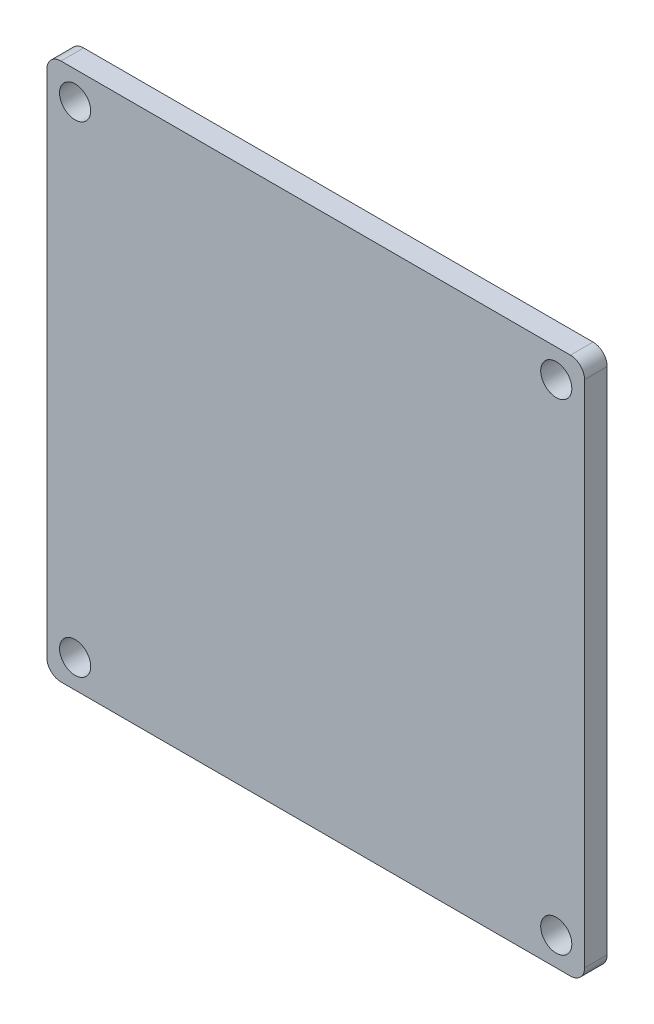
ISO-10303-21;
HEADER;
FILE_DESCRIPTION(('STEP AP214'),'2;1');
FILE_NAME('part.step','',(''),(''),'','','');
FILE_SCHEMA(('AUTOMOTIVE_DESIGN { 1 0 10303 214 1 1 1 1 }'));
ENDSEC;
DATA;
#1=APPLICATION_CONTEXT('core data for automotive mechanical design processes');
#2=APPLICATION_PROTOCOL_DEFINITION('international standard','automotive_design',2000,#1);
#3=PRODUCT_CONTEXT('',#1,'mechanical');
#4=PRODUCT('Part','Part','',(#3));
#5=PRODUCT_RELATED_PRODUCT_CATEGORY('part','',(#4));
#6=PRODUCT_DEFINITION_FORMATION('','',#4);
#7=PRODUCT_DEFINITION_CONTEXT('part definition',#1,'design');
#8=PRODUCT_DEFINITION('design','',#6,#7);
#9=PRODUCT_DEFINITION_SHAPE('','',#8);
#10=(LENGTH_UNIT() NAMED_UNIT(*) SI_UNIT(.MILLI.,.METRE.));
#11=(NAMED_UNIT(*) PLANE_ANGLE_UNIT() SI_UNIT($,.RADIAN.));
#12=(NAMED_UNIT(*) SI_UNIT($,.STERADIAN.) SOLID_ANGLE_UNIT());
#13=UNCERTAINTY_MEASURE_WITH_UNIT(LENGTH_MEASURE(1.E-05),#10,'distance_accuracy_value','');
#14=(GEOMETRIC_REPRESENTATION_CONTEXT(3) GLOBAL_UNCERTAINTY_ASSIGNED_CONTEXT((#13)) GLOBAL_UNIT_ASSIGNED_CONTEXT((#10,
#11,#12)) REPRESENTATION_CONTEXT('',''));
#15=CARTESIAN_POINT('',(0.,0.,0.));
#16=DIRECTION('',(0.,0.,1.));
#17=DIRECTION('',(1.,0.,0.));
#18=AXIS2_PLACEMENT_3D('',#15,#16,#17);
#19=CARTESIAN_POINT('',(-19.,19.,1.6));
#20=DIRECTION('',(1.,0.,0.));
#21=DIRECTION('',(0.,1.,0.));
#22=AXIS2_PLACEMENT_3D('',#19,#20,#21);
#23=PLANE('',#22);
#24=DIRECTION('',(0.,-1.,0.));
#25=VECTOR('',#24,1.);
#26=CARTESIAN_POINT('',(-19.,19.,0.));
#27=LINE('',#26,#25);
#28=CARTESIAN_POINT('',(-19.,18.,0.));
#29=VERTEX_POINT('',#28);
#30=CARTESIAN_POINT('',(-19.,-18.,0.));
#31=VERTEX_POINT('',#30);
#32=EDGE_CURVE('E128',#29,#31,#27,.T.);
#33=ORIENTED_EDGE('',*,*,#32,.T.);
#34=DIRECTION('',(0.,0.,-1.));
#35=VECTOR('',#34,1.);
#36=CARTESIAN_POINT('',(-19.,-18.,1.6));
#37=LINE('',#36,#35);
#38=CARTESIAN_POINT('',(-19.,-18.,1.6));
#39=VERTEX_POINT('',#38);
#40=EDGE_CURVE('E106',#31,#39,#37,.F.);
#41=ORIENTED_EDGE('',*,*,#40,.T.);
#42=DIRECTION('',(0.,-1.,0.));
#43=VECTOR('',#42,1.);
#44=CARTESIAN_POINT('',(-19.,19.,1.6));
#45=LINE('',#44,#43);
#46=CARTESIAN_POINT('',(-19.,18.,1.6));
#47=VERTEX_POINT('',#46);
#48=EDGE_CURVE('E138',#47,#39,#45,.T.);
#49=ORIENTED_EDGE('',*,*,#48,.F.);
#50=DIRECTION('',(0.,0.,-1.));
#51=VECTOR('',#50,1.);
#52=CARTESIAN_POINT('',(-19.,18.,1.6));
#53=LINE('',#52,#51);
#54=EDGE_CURVE('E111',#47,#29,#53,.T.);
#55=ORIENTED_EDGE('',*,*,#54,.T.);
#56=EDGE_LOOP('',(#33,#41,#49,#55));
#57=FACE_BOUND('',#56,.T.);
#58=ADVANCED_FACE('F35',(#57),#23,.F.);
#59=CARTESIAN_POINT('',(-19.,-19.,1.6));
#60=DIRECTION('',(0.,1.,0.));
#61=DIRECTION('',(0.,0.,1.));
#62=AXIS2_PLACEMENT_3D('',#59,#60,#61);
#63=PLANE('',#62);
#64=DIRECTION('',(1.,0.,0.));
#65=VECTOR('',#64,1.);
#66=CARTESIAN_POINT('',(-19.,-19.,1.6));
#67=LINE('',#66,#65);
#68=CARTESIAN_POINT('',(-18.,-19.,1.6));
#69=VERTEX_POINT('',#68);
#70=CARTESIAN_POINT('',(18.,-19.,1.6));
#71=VERTEX_POINT('',#70);
#72=EDGE_CURVE('E121',#69,#71,#67,.T.);
#73=ORIENTED_EDGE('',*,*,#72,.F.);
#74=DIRECTION('',(0.,0.,-1.));
#75=VECTOR('',#74,1.);
#76=CARTESIAN_POINT('',(-18.,-19.,1.6));
#77=LINE('',#76,#75);
#78=CARTESIAN_POINT('',(-18.,-19.,0.));
#79=VERTEX_POINT('',#78);
#80=EDGE_CURVE('E105',#69,#79,#77,.T.);
#81=ORIENTED_EDGE('',*,*,#80,.T.);
#82=DIRECTION('',(1.,0.,0.));
#83=VECTOR('',#82,1.);
#84=CARTESIAN_POINT('',(-19.,-19.,0.));
#85=LINE('',#84,#83);
#86=CARTESIAN_POINT('',(18.,-19.,0.));
#87=VERTEX_POINT('',#86);
#88=EDGE_CURVE('E118',#79,#87,#85,.T.);
#89=ORIENTED_EDGE('',*,*,#88,.T.);
#90=DIRECTION('',(0.,0.,-1.));
#91=VECTOR('',#90,1.);
#92=CARTESIAN_POINT('',(18.,-19.,1.6));
#93=LINE('',#92,#91);
#94=EDGE_CURVE('E123',#87,#71,#93,.F.);
#95=ORIENTED_EDGE('',*,*,#94,.T.);
#96=EDGE_LOOP('',(#73,#81,#89,#95));
#97=FACE_BOUND('',#96,.T.);
#98=ADVANCED_FACE('F117',(#97),#63,.F.);
#99=CARTESIAN_POINT('',(19.,19.,1.6));
#100=DIRECTION('',(-1.,0.,0.));
#101=DIRECTION('',(0.,0.,1.));
#102=AXIS2_PLACEMENT_3D('',#99,#100,#101);
#103=PLANE('',#102);
#104=DIRECTION('',(0.,1.,0.));
#105=VECTOR('',#104,1.);
#106=CARTESIAN_POINT('',(19.,19.,1.6));
#107=LINE('',#106,#105);
#108=CARTESIAN_POINT('',(19.,-18.,1.6));
#109=VERTEX_POINT('',#108);
#110=CARTESIAN_POINT('',(19.,18.,1.6));
#111=VERTEX_POINT('',#110);
#112=EDGE_CURVE('E164',#109,#111,#107,.T.);
#113=ORIENTED_EDGE('',*,*,#112,.F.);
#114=DIRECTION('',(0.,0.,-1.));
#115=VECTOR('',#114,1.);
#116=CARTESIAN_POINT('',(19.,-18.,1.6));
#117=LINE('',#116,#115);
#118=CARTESIAN_POINT('',(19.,-18.,0.));
#119=VERTEX_POINT('',#118);
#120=EDGE_CURVE('E157',#109,#119,#117,.T.);
#121=ORIENTED_EDGE('',*,*,#120,.T.);
#122=DIRECTION('',(0.,1.,0.));
#123=VECTOR('',#122,1.);
#124=CARTESIAN_POINT('',(19.,19.,0.));
#125=LINE('',#124,#123);
#126=CARTESIAN_POINT('',(19.,18.,0.));
#127=VERTEX_POINT('',#126);
#128=EDGE_CURVE('E127',#119,#127,#125,.T.);
#129=ORIENTED_EDGE('',*,*,#128,.T.);
#130=DIRECTION('',(0.,0.,-1.));
#131=VECTOR('',#130,1.);
#132=CARTESIAN_POINT('',(19.,18.,1.6));
#133=LINE('',#132,#131);
#134=EDGE_CURVE('E155',#127,#111,#133,.F.);
#135=ORIENTED_EDGE('',*,*,#134,.T.);
#136=EDGE_LOOP('',(#113,#121,#129,#135));
#137=FACE_BOUND('',#136,.T.);
#138=ADVANCED_FACE('F162',(#137),#103,.F.);
#139=CARTESIAN_POINT('',(-19.,19.,1.6));
#140=DIRECTION('',(0.,-1.,0.));
#141=DIRECTION('',(0.,0.,-1.));
#142=AXIS2_PLACEMENT_3D('',#139,#140,#141);
#143=PLANE('',#142);
#144=DIRECTION('',(-1.,0.,0.));
#145=VECTOR('',#144,1.);
#146=CARTESIAN_POINT('',(-19.,19.,1.6));
#147=LINE('',#146,#145);
#148=CARTESIAN_POINT('',(18.,19.,1.6));
#149=VERTEX_POINT('',#148);
#150=CARTESIAN_POINT('',(-18.,19.,1.6));
#151=VERTEX_POINT('',#150);
#152=EDGE_CURVE('E139',#149,#151,#147,.T.);
#153=ORIENTED_EDGE('',*,*,#152,.F.);
#154=DIRECTION('',(0.,0.,-1.));
#155=VECTOR('',#154,1.);
#156=CARTESIAN_POINT('',(18.,19.,1.6));
#157=LINE('',#156,#155);
#158=CARTESIAN_POINT('',(18.,19.,0.));
#159=VERTEX_POINT('',#158);
#160=EDGE_CURVE('E11',#149,#159,#157,.T.);
#161=ORIENTED_EDGE('',*,*,#160,.T.);
#162=DIRECTION('',(-1.,0.,0.));
#163=VECTOR('',#162,1.);
#164=CARTESIAN_POINT('',(-19.,19.,0.));
#165=LINE('',#164,#163);
#166=CARTESIAN_POINT('',(-18.,19.,0.));
#167=VERTEX_POINT('',#166);
#168=EDGE_CURVE('E131',#159,#167,#165,.T.);
#169=ORIENTED_EDGE('',*,*,#168,.T.);
#170=DIRECTION('',(0.,0.,-1.));
#171=VECTOR('',#170,1.);
#172=CARTESIAN_POINT('',(-18.,19.,1.6));
#173=LINE('',#172,#171);
#174=EDGE_CURVE('E43',#167,#151,#173,.F.);
#175=ORIENTED_EDGE('',*,*,#174,.T.);
#176=EDGE_LOOP('',(#153,#161,#169,#175));
#177=FACE_BOUND('',#176,.T.);
#178=ADVANCED_FACE('F171',(#177),#143,.F.);
#179=CARTESIAN_POINT('',(0.,0.,1.6));
#180=DIRECTION('',(0.,0.,1.));
#181=DIRECTION('',(1.,0.,0.));
#182=AXIS2_PLACEMENT_3D('',#179,#180,#181);
#183=PLANE('',#182);
#184=CARTESIAN_POINT('',(-17.,-17.,1.6));
#185=DIRECTION('',(0.,0.,1.));
#186=DIRECTION('',(1.,0.,0.));
#187=AXIS2_PLACEMENT_3D('',#184,#185,#186);
#188=CIRCLE('',#187,1.1);
#189=CARTESIAN_POINT('',(-15.9,-17.,1.6));
#190=VERTEX_POINT('',#189);
#191=EDGE_CURVE('E184',#190,#190,#188,.T.);
#192=ORIENTED_EDGE('',*,*,#191,.F.);
#193=EDGE_LOOP('',(#192));
#194=FACE_BOUND('',#193,.T.);
#195=CARTESIAN_POINT('',(17.,17.,1.6));
#196=DIRECTION('',(0.,0.,1.));
#197=DIRECTION('',(1.,0.,0.));
#198=AXIS2_PLACEMENT_3D('',#195,#196,#197);
#199=CIRCLE('',#198,1.1);
#200=CARTESIAN_POINT('',(18.1,17.,1.6));
#201=VERTEX_POINT('',#200);
#202=EDGE_CURVE('E190',#201,#201,#199,.T.);
#203=ORIENTED_EDGE('',*,*,#202,.F.);
#204=EDGE_LOOP('',(#203));
#205=FACE_BOUND('',#204,.T.);
#206=CARTESIAN_POINT('',(17.,-17.,1.6));
#207=DIRECTION('',(0.,0.,1.));
#208=DIRECTION('',(1.,0.,0.));
#209=AXIS2_PLACEMENT_3D('',#206,#207,#208);
#210=CIRCLE('',#209,1.1);
#211=CARTESIAN_POINT('',(18.1,-17.,1.6));
#212=VERTEX_POINT('',#211);
#213=EDGE_CURVE('E196',#212,#212,#210,.T.);
#214=ORIENTED_EDGE('',*,*,#213,.F.);
#215=EDGE_LOOP('',(#214));
#216=FACE_BOUND('',#215,.T.);
#217=CARTESIAN_POINT('',(-17.,17.,1.6));
#218=DIRECTION('',(0.,0.,1.));
#219=DIRECTION('',(1.,0.,0.));
#220=AXIS2_PLACEMENT_3D('',#217,#218,#219);
#221=CIRCLE('',#220,1.1);
#222=CARTESIAN_POINT('',(-15.9,17.,1.6));
#223=VERTEX_POINT('',#222);
#224=EDGE_CURVE('E178',#223,#223,#221,.T.);
#225=ORIENTED_EDGE('',*,*,#224,.F.);
#226=EDGE_LOOP('',(#225));
#227=FACE_BOUND('',#226,.T.);
#228=ORIENTED_EDGE('',*,*,#48,.T.);
#229=CARTESIAN_POINT('',(-18.,-18.,1.6));
#230=DIRECTION('',(0.,0.,1.));
#231=DIRECTION('',(1.,0.,0.));
#232=AXIS2_PLACEMENT_3D('',#229,#230,#231);
#233=CIRCLE('',#232,1.);
#234=EDGE_CURVE('E153',#39,#69,#233,.T.);
#235=ORIENTED_EDGE('',*,*,#234,.T.);
#236=ORIENTED_EDGE('',*,*,#72,.T.);
#237=CARTESIAN_POINT('',(18.,-18.,1.6));
#238=DIRECTION('',(0.,0.,1.));
#239=DIRECTION('',(1.,0.,0.));
#240=AXIS2_PLACEMENT_3D('',#237,#238,#239);
#241=CIRCLE('',#240,1.);
#242=EDGE_CURVE('E151',#71,#109,#241,.T.);
#243=ORIENTED_EDGE('',*,*,#242,.T.);
#244=ORIENTED_EDGE('',*,*,#112,.T.);
#245=CARTESIAN_POINT('',(18.,18.,1.6));
#246=DIRECTION('',(0.,0.,1.));
#247=DIRECTION('',(1.,0.,0.));
#248=AXIS2_PLACEMENT_3D('',#245,#246,#247);
#249=CIRCLE('',#248,1.);
#250=EDGE_CURVE('E56',#111,#149,#249,.T.);
#251=ORIENTED_EDGE('',*,*,#250,.T.);
#252=ORIENTED_EDGE('',*,*,#152,.T.);
#253=CARTESIAN_POINT('',(-18.,18.,1.6));
#254=DIRECTION('',(0.,0.,1.));
#255=DIRECTION('',(1.,0.,0.));
#256=AXIS2_PLACEMENT_3D('',#253,#254,#255);
#257=CIRCLE('',#256,1.);
#258=EDGE_CURVE('E148',#151,#47,#257,.T.);
#259=ORIENTED_EDGE('',*,*,#258,.T.);
#260=EDGE_LOOP('',(#228,#235,#236,#243,#244,#251,#252,#259));
#261=FACE_BOUND('',#260,.T.);
#262=ADVANCED_FACE('F212',(#194,#205,#216,#227,#261),#183,.T.);
#263=CARTESIAN_POINT('',(0.,0.,0.));
#264=DIRECTION('',(0.,0.,1.));
#265=DIRECTION('',(1.,0.,0.));
#266=AXIS2_PLACEMENT_3D('',#263,#264,#265);
#267=PLANE('',#266);
#268=CARTESIAN_POINT('',(-17.,-17.,0.));
#269=DIRECTION('',(0.,0.,1.));
#270=DIRECTION('',(1.,0.,0.));
#271=AXIS2_PLACEMENT_3D('',#268,#269,#270);
#272=CIRCLE('',#271,1.1);
#273=CARTESIAN_POINT('',(-15.9,-17.,0.));
#274=VERTEX_POINT('',#273);
#275=EDGE_CURVE('E187',#274,#274,#272,.T.);
#276=ORIENTED_EDGE('',*,*,#275,.T.);
#277=EDGE_LOOP('',(#276));
#278=FACE_BOUND('',#277,.T.);
#279=CARTESIAN_POINT('',(17.,17.,0.));
#280=DIRECTION('',(0.,0.,1.));
#281=DIRECTION('',(1.,0.,0.));
#282=AXIS2_PLACEMENT_3D('',#279,#280,#281);
#283=CIRCLE('',#282,1.1);
#284=CARTESIAN_POINT('',(18.1,17.,0.));
#285=VERTEX_POINT('',#284);
#286=EDGE_CURVE('E193',#285,#285,#283,.T.);
#287=ORIENTED_EDGE('',*,*,#286,.T.);
#288=EDGE_LOOP('',(#287));
#289=FACE_BOUND('',#288,.T.);
#290=CARTESIAN_POINT('',(17.,-17.,0.));
#291=DIRECTION('',(0.,0.,1.));
#292=DIRECTION('',(1.,0.,0.));
#293=AXIS2_PLACEMENT_3D('',#290,#291,#292);
#294=CIRCLE('',#293,1.1);
#295=CARTESIAN_POINT('',(18.1,-17.,0.));
#296=VERTEX_POINT('',#295);
#297=EDGE_CURVE('E181',#296,#296,#294,.T.);
#298=ORIENTED_EDGE('',*,*,#297,.T.);
#299=EDGE_LOOP('',(#298));
#300=FACE_BOUND('',#299,.T.);
#301=CARTESIAN_POINT('',(-17.,17.,0.));
#302=DIRECTION('',(0.,0.,1.));
#303=DIRECTION('',(1.,0.,0.));
#304=AXIS2_PLACEMENT_3D('',#301,#302,#303);
#305=CIRCLE('',#304,1.1);
#306=CARTESIAN_POINT('',(-15.9,17.,0.));
#307=VERTEX_POINT('',#306);
#308=EDGE_CURVE('E133',#307,#307,#305,.T.);
#309=ORIENTED_EDGE('',*,*,#308,.T.);
#310=EDGE_LOOP('',(#309));
#311=FACE_BOUND('',#310,.T.);
#312=ORIENTED_EDGE('',*,*,#88,.F.);
#313=CARTESIAN_POINT('',(-18.,-18.,0.));
#314=DIRECTION('',(0.,0.,1.));
#315=DIRECTION('',(1.,0.,0.));
#316=AXIS2_PLACEMENT_3D('',#313,#314,#315);
#317=CIRCLE('',#316,1.);
#318=EDGE_CURVE('E101',#79,#31,#317,.F.);
#319=ORIENTED_EDGE('',*,*,#318,.T.);
#320=ORIENTED_EDGE('',*,*,#32,.F.);
#321=CARTESIAN_POINT('',(-18.,18.,0.));
#322=DIRECTION('',(0.,0.,1.));
#323=DIRECTION('',(1.,0.,0.));
#324=AXIS2_PLACEMENT_3D('',#321,#322,#323);
#325=CIRCLE('',#324,1.);
#326=EDGE_CURVE('E122',#29,#167,#325,.F.);
#327=ORIENTED_EDGE('',*,*,#326,.T.);
#328=ORIENTED_EDGE('',*,*,#168,.F.);
#329=CARTESIAN_POINT('',(18.,18.,0.));
#330=DIRECTION('',(0.,0.,1.));
#331=DIRECTION('',(1.,0.,0.));
#332=AXIS2_PLACEMENT_3D('',#329,#330,#331);
#333=CIRCLE('',#332,1.);
#334=EDGE_CURVE('E142',#159,#127,#333,.F.);
#335=ORIENTED_EDGE('',*,*,#334,.T.);
#336=ORIENTED_EDGE('',*,*,#128,.F.);
#337=CARTESIAN_POINT('',(18.,-18.,0.));
#338=DIRECTION('',(0.,0.,1.));
#339=DIRECTION('',(1.,0.,0.));
#340=AXIS2_PLACEMENT_3D('',#337,#338,#339);
#341=CIRCLE('',#340,1.);
#342=EDGE_CURVE('E112',#119,#87,#341,.F.);
#343=ORIENTED_EDGE('',*,*,#342,.T.);
#344=EDGE_LOOP('',(#312,#319,#320,#327,#328,#335,#336,#343));
#345=FACE_BOUND('',#344,.T.);
#346=ADVANCED_FACE('F125',(#278,#289,#300,#311,#345),#267,.F.);
#347=CARTESIAN_POINT('',(-17.,17.,0.));
#348=DIRECTION('',(0.,0.,1.));
#349=DIRECTION('',(1.,0.,0.));
#350=AXIS2_PLACEMENT_3D('',#347,#348,#349);
#351=CYLINDRICAL_SURFACE('',#350,1.1);
#352=ORIENTED_EDGE('',*,*,#308,.F.);
#353=EDGE_LOOP('',(#352));
#354=FACE_BOUND('',#353,.T.);
#355=ORIENTED_EDGE('',*,*,#224,.T.);
#356=EDGE_LOOP('',(#355));
#357=FACE_BOUND('',#356,.T.);
#358=ADVANCED_FACE('F208',(#354,#357),#351,.F.);
#359=CARTESIAN_POINT('',(17.,-17.,0.));
#360=DIRECTION('',(0.,0.,1.));
#361=DIRECTION('',(1.,0.,0.));
#362=AXIS2_PLACEMENT_3D('',#359,#360,#361);
#363=CYLINDRICAL_SURFACE('',#362,1.1);
#364=ORIENTED_EDGE('',*,*,#297,.F.);
#365=EDGE_LOOP('',(#364));
#366=FACE_BOUND('',#365,.T.);
#367=ORIENTED_EDGE('',*,*,#213,.T.);
#368=EDGE_LOOP('',(#367));
#369=FACE_BOUND('',#368,.T.);
#370=ADVANCED_FACE('F204',(#366,#369),#363,.F.);
#371=CARTESIAN_POINT('',(17.,17.,0.));
#372=DIRECTION('',(0.,0.,1.));
#373=DIRECTION('',(1.,0.,0.));
#374=AXIS2_PLACEMENT_3D('',#371,#372,#373);
#375=CYLINDRICAL_SURFACE('',#374,1.1);
#376=ORIENTED_EDGE('',*,*,#286,.F.);
#377=EDGE_LOOP('',(#376));
#378=FACE_BOUND('',#377,.T.);
#379=ORIENTED_EDGE('',*,*,#202,.T.);
#380=EDGE_LOOP('',(#379));
#381=FACE_BOUND('',#380,.T.);
#382=ADVANCED_FACE('F207',(#378,#381),#375,.F.);
#383=CARTESIAN_POINT('',(-17.,-17.,0.));
#384=DIRECTION('',(0.,0.,1.));
#385=DIRECTION('',(1.,0.,0.));
#386=AXIS2_PLACEMENT_3D('',#383,#384,#385);
#387=CYLINDRICAL_SURFACE('',#386,1.1);
#388=ORIENTED_EDGE('',*,*,#275,.F.);
#389=EDGE_LOOP('',(#388));
#390=FACE_BOUND('',#389,.T.);
#391=ORIENTED_EDGE('',*,*,#191,.T.);
#392=EDGE_LOOP('',(#391));
#393=FACE_BOUND('',#392,.T.);
#394=ADVANCED_FACE('F238',(#390,#393),#387,.F.);
#395=CARTESIAN_POINT('',(-18.,-18.,1.6));
#396=DIRECTION('',(0.,0.,-1.));
#397=DIRECTION('',(-1.,0.,0.));
#398=AXIS2_PLACEMENT_3D('',#395,#396,#397);
#399=CYLINDRICAL_SURFACE('',#398,1.);
#400=ORIENTED_EDGE('',*,*,#234,.F.);
#401=ORIENTED_EDGE('',*,*,#40,.F.);
#402=ORIENTED_EDGE('',*,*,#318,.F.);
#403=ORIENTED_EDGE('',*,*,#80,.F.);
#404=EDGE_LOOP('',(#400,#401,#402,#403));
#405=FACE_BOUND('',#404,.T.);
#406=ADVANCED_FACE('F104',(#405),#399,.T.);
#407=CARTESIAN_POINT('',(18.,-18.,1.6));
#408=DIRECTION('',(0.,0.,-1.));
#409=DIRECTION('',(-1.,0.,0.));
#410=AXIS2_PLACEMENT_3D('',#407,#408,#409);
#411=CYLINDRICAL_SURFACE('',#410,1.);
#412=ORIENTED_EDGE('',*,*,#242,.F.);
#413=ORIENTED_EDGE('',*,*,#94,.F.);
#414=ORIENTED_EDGE('',*,*,#342,.F.);
#415=ORIENTED_EDGE('',*,*,#120,.F.);
#416=EDGE_LOOP('',(#412,#413,#414,#415));
#417=FACE_BOUND('',#416,.T.);
#418=ADVANCED_FACE('F226',(#417),#411,.T.);
#419=CARTESIAN_POINT('',(18.,18.,1.6));
#420=DIRECTION('',(0.,0.,-1.));
#421=DIRECTION('',(-1.,0.,0.));
#422=AXIS2_PLACEMENT_3D('',#419,#420,#421);
#423=CYLINDRICAL_SURFACE('',#422,1.);
#424=ORIENTED_EDGE('',*,*,#250,.F.);
#425=ORIENTED_EDGE('',*,*,#134,.F.);
#426=ORIENTED_EDGE('',*,*,#334,.F.);
#427=ORIENTED_EDGE('',*,*,#160,.F.);
#428=EDGE_LOOP('',(#424,#425,#426,#427));
#429=FACE_BOUND('',#428,.T.);
#430=ADVANCED_FACE('F170',(#429),#423,.T.);
#431=CARTESIAN_POINT('',(-18.,18.,1.6));
#432=DIRECTION('',(0.,0.,-1.));
#433=DIRECTION('',(-1.,0.,0.));
#434=AXIS2_PLACEMENT_3D('',#431,#432,#433);
#435=CYLINDRICAL_SURFACE('',#434,1.);
#436=ORIENTED_EDGE('',*,*,#258,.F.);
#437=ORIENTED_EDGE('',*,*,#174,.F.);
#438=ORIENTED_EDGE('',*,*,#326,.F.);
#439=ORIENTED_EDGE('',*,*,#54,.F.);
#440=EDGE_LOOP('',(#436,#437,#438,#439));
#441=FACE_BOUND('',#440,.T.);
#442=ADVANCED_FACE('F37',(#441),#435,.T.);
#443=CLOSED_SHELL('',(#58,#98,#138,#178,#262,#346,#358,#370,#382,#394,#406,#418,#430,#442));
#444=MANIFOLD_SOLID_BREP('B2',#443);
#445=ADVANCED_BREP_SHAPE_REPRESENTATION('',(#18,#444),#14);
#446=SHAPE_DEFINITION_REPRESENTATION(#9,#445);
ENDSEC;
END-ISO-10303-21;
